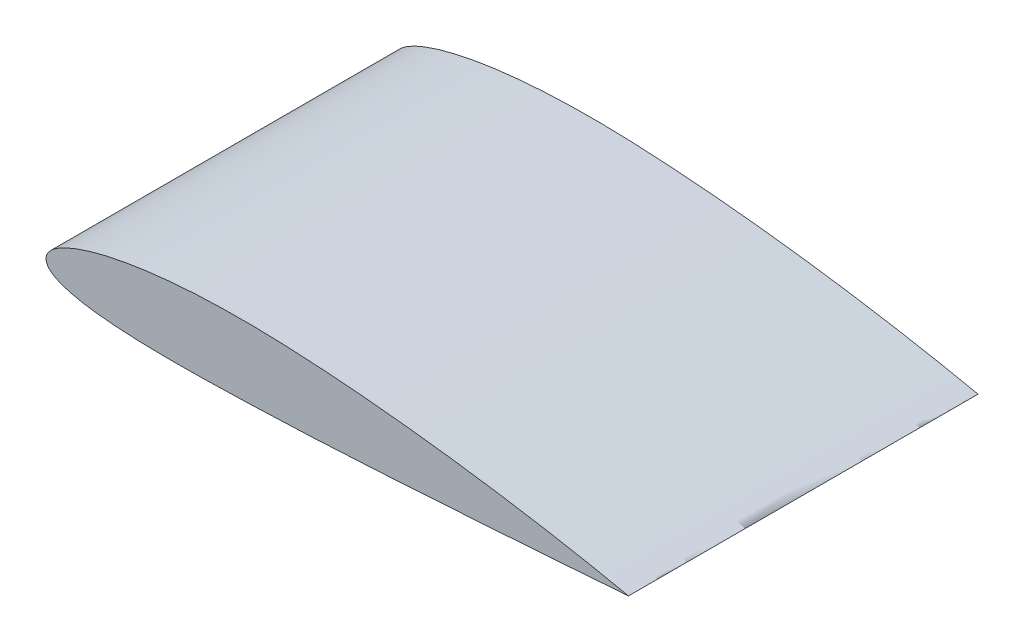
ISO-10303-21;
HEADER;
FILE_DESCRIPTION(('STEP AP214'),'2;1');
FILE_NAME('part.step','',(''),(''),'','','');
FILE_SCHEMA(('AUTOMOTIVE_DESIGN { 1 0 10303 214 1 1 1 1 }'));
ENDSEC;
DATA;
#1=APPLICATION_CONTEXT('core data for automotive mechanical design processes');
#2=APPLICATION_PROTOCOL_DEFINITION('international standard','automotive_design',2000,#1);
#3=PRODUCT_CONTEXT('',#1,'mechanical');
#4=PRODUCT('Part','Part','',(#3));
#5=PRODUCT_RELATED_PRODUCT_CATEGORY('part','',(#4));
#6=PRODUCT_DEFINITION_FORMATION('','',#4);
#7=PRODUCT_DEFINITION_CONTEXT('part definition',#1,'design');
#8=PRODUCT_DEFINITION('design','',#6,#7);
#9=PRODUCT_DEFINITION_SHAPE('','',#8);
#10=(LENGTH_UNIT() NAMED_UNIT(*) SI_UNIT(.MILLI.,.METRE.));
#11=(NAMED_UNIT(*) PLANE_ANGLE_UNIT() SI_UNIT($,.RADIAN.));
#12=(NAMED_UNIT(*) SI_UNIT($,.STERADIAN.) SOLID_ANGLE_UNIT());
#13=UNCERTAINTY_MEASURE_WITH_UNIT(LENGTH_MEASURE(1.E-05),#10,'distance_accuracy_value','');
#14=(GEOMETRIC_REPRESENTATION_CONTEXT(3) GLOBAL_UNCERTAINTY_ASSIGNED_CONTEXT((#13)) GLOBAL_UNIT_ASSIGNED_CONTEXT((#10,
#11,#12)) REPRESENTATION_CONTEXT('',''));
#15=CARTESIAN_POINT('',(0.,0.,0.));
#16=DIRECTION('',(0.,0.,1.));
#17=DIRECTION('',(1.,0.,0.));
#18=AXIS2_PLACEMENT_3D('',#15,#16,#17);
#19=CARTESIAN_POINT('',(150.,0.,90.));
#20=CARTESIAN_POINT('',(150.000113216751,0.00177285224793415,90.));
#21=CARTESIAN_POINT('',(149.921239361388,0.014188066800935,90.));
#22=CARTESIAN_POINT('',(149.840387791631,0.0358715199111897,90.));
#23=CARTESIAN_POINT('',(149.640781800527,0.075849773183066,90.));
#24=CARTESIAN_POINT('',(149.392078651045,0.129807126318734,90.));
#25=CARTESIAN_POINT('',(149.060600085422,0.199990784032261,90.));
#26=CARTESIAN_POINT('',(148.66042417078,0.284481373535448,90.));
#27=CARTESIAN_POINT('',(148.186888977134,0.384371921326002,90.));
#28=CARTESIAN_POINT('',(147.64208042319,0.4983469445077,90.));
#29=CARTESIAN_POINT('',(147.026096757238,0.62680991680176,90.));
#30=CARTESIAN_POINT('',(146.339540429164,0.768724971584994,90.));
#31=CARTESIAN_POINT('',(145.583125546069,0.924267178456114,90.));
#32=CARTESIAN_POINT('',(144.757444860907,1.09266217050406,90.));
#33=CARTESIAN_POINT('',(143.863349901552,1.27344456504119,90.));
#34=CARTESIAN_POINT('',(142.901656771357,1.4663863968593,90.));
#35=CARTESIAN_POINT('',(141.873202246748,1.67037475823978,90.));
#36=CARTESIAN_POINT('',(140.779031297345,1.88528433254788,90.));
#37=CARTESIAN_POINT('',(139.620134054833,2.11031172200272,90.));
#38=CARTESIAN_POINT('',(138.397638730328,2.3452126901847,90.));
#39=CARTESIAN_POINT('',(137.112596550764,2.58882458800582,90.));
#40=CARTESIAN_POINT('',(135.766314995586,2.84074487547482,90.));
#41=CARTESIAN_POINT('',(134.360029922316,3.10030017434261,90.));
#42=CARTESIAN_POINT('',(132.89510147769,3.36689567808418,90.));
#43=CARTESIAN_POINT('',(131.372880009807,3.63983625031875,90.));
#44=CARTESIAN_POINT('',(129.79489890091,3.91827985036904,90.));
#45=CARTESIAN_POINT('',(128.162544551591,4.20149249299851,90.));
#46=CARTESIAN_POINT('',(126.477528689931,4.48913421178522,90.));
#47=CARTESIAN_POINT('',(124.741283384557,4.78015890802335,90.));
#48=CARTESIAN_POINT('',(122.955664154135,5.07409806422994,90.));
#49=CARTESIAN_POINT('',(121.122204321478,5.36989331956641,90.));
#50=CARTESIAN_POINT('',(119.242834728598,5.66729606612383,90.));
#51=CARTESIAN_POINT('',(117.319233152594,5.96520336358199,90.));
#52=CARTESIAN_POINT('',(115.353399457422,6.26318283516786,90.));
#53=CARTESIAN_POINT('',(113.347150514401,6.56036872025142,90.));
#54=CARTESIAN_POINT('',(111.302509581045,6.85621489058943,90.));
#55=CARTESIAN_POINT('',(109.221376761532,7.15003078265159,90.));
#56=CARTESIAN_POINT('',(107.10581913627,7.44087658914807,90.));
#57=CARTESIAN_POINT('',(104.957931758204,7.72837998052587,90.));
#58=CARTESIAN_POINT('',(102.779829053978,8.01162883347343,90.));
#59=CARTESIAN_POINT('',(100.57363767051,8.29012723074574,90.));
#60=CARTESIAN_POINT('',(98.3414345197039,8.5630450436343,90.));
#61=CARTESIAN_POINT('',(96.0854790858782,8.82980262926822,90.));
#62=CARTESIAN_POINT('',(93.8080337795921,9.08986204992157,90.));
#63=CARTESIAN_POINT('',(91.511339391243,9.3424549993153,90.));
#64=CARTESIAN_POINT('',(89.1976707328889,9.58668778535293,90.));
#65=CARTESIAN_POINT('',(86.8692652264272,9.82230590537347,90.));
#66=CARTESIAN_POINT('',(84.5285234139239,10.0487006490159,90.));
#67=CARTESIAN_POINT('',(82.1776445380546,10.2647224017282,90.));
#68=CARTESIAN_POINT('',(79.819143688128,10.4704272334074,90.));
#69=CARTESIAN_POINT('',(77.4552218361354,10.6647703250394,90.));
#70=CARTESIAN_POINT('',(75.0883629006883,10.8475060451903,90.));
#71=CARTESIAN_POINT('',(72.7208472902247,11.017818628952,90.));
#72=CARTESIAN_POINT('',(70.3551070609961,11.1748869847106,90.));
#73=CARTESIAN_POINT('',(67.9934998772652,11.3190833130269,90.));
#74=CARTESIAN_POINT('',(65.6384111386436,11.4489169787279,90.));
#75=CARTESIAN_POINT('',(63.2922337082543,11.5645353912385,90.));
#76=CARTESIAN_POINT('',(60.9536614648223,11.665252270422,90.));
#77=CARTESIAN_POINT('',(58.6224769115101,11.7506800898829,90.));
#78=CARTESIAN_POINT('',(56.300885149099,11.81465053905,90.));
#79=CARTESIAN_POINT('',(53.9949998635085,11.8581881878371,90.));
#80=CARTESIAN_POINT('',(51.7097537153545,11.8805066732226,90.));
#81=CARTESIAN_POINT('',(49.4475551147668,11.8814387351758,90.));
#82=CARTESIAN_POINT('',(47.2108472765111,11.8614704165669,90.));
#83=CARTESIAN_POINT('',(45.0019437936583,11.8197374210162,90.));
#84=CARTESIAN_POINT('',(42.8232192868277,11.757393470768,90.));
#85=CARTESIAN_POINT('',(40.6769564437603,11.6734341017464,90.));
#86=CARTESIAN_POINT('',(38.565475313804,11.5688600599739,90.));
#87=CARTESIAN_POINT('',(36.4909522434168,11.4434357852618,90.));
#88=CARTESIAN_POINT('',(34.4556027015691,11.2979589994199,90.));
#89=CARTESIAN_POINT('',(32.4615706377804,11.1322151883279,90.));
#90=CARTESIAN_POINT('',(30.5109656102769,10.9471219442148,90.));
#91=CARTESIAN_POINT('',(28.6058662330469,10.7429022439941,90.));
#92=CARTESIAN_POINT('',(26.7482386483878,10.520352218942,90.));
#93=CARTESIAN_POINT('',(24.9400870672366,10.2796898510617,90.));
#94=CARTESIAN_POINT('',(23.1832434100823,10.0220726405033,90.));
#95=CARTESIAN_POINT('',(21.4795595088737,9.74787120930977,90.));
#96=CARTESIAN_POINT('',(19.8307385650777,9.45806431742482,90.));
#97=CARTESIAN_POINT('',(18.2385027267738,9.15310937460293,90.));
#98=CARTESIAN_POINT('',(16.7044275797058,8.83442687315617,90.));
#99=CARTESIAN_POINT('',(15.2301175902508,8.50231400325353,90.));
#100=CARTESIAN_POINT('',(13.8170756199545,8.15771601197067,90.));
#101=CARTESIAN_POINT('',(12.4665506425298,7.80208553751532,90.));
#102=CARTESIAN_POINT('',(11.1800605952099,7.4356946900673,90.));
#103=CARTESIAN_POINT('',(9.95873500301244,7.05972538908994,90.));
#104=CARTESIAN_POINT('',(8.80365956767617,6.67541441047379,90.));
#105=CARTESIAN_POINT('',(7.7161007799878,6.28317803049887,90.));
#106=CARTESIAN_POINT('',(6.69696394633503,5.88430015218207,90.));
#107=CARTESIAN_POINT('',(5.74712597272768,5.47964720124637,90.));
#108=CARTESIAN_POINT('',(4.86750545006497,5.0699459514628,90.));
#109=CARTESIAN_POINT('',(4.05886598209945,4.65596502600832,90.));
#110=CARTESIAN_POINT('',(3.32173745378701,4.23886123223077,90.));
#111=CARTESIAN_POINT('',(2.65675091884288,3.81912965603896,90.));
#112=CARTESIAN_POINT('',(2.06457278557886,3.39725235980044,90.));
#113=CARTESIAN_POINT('',(1.54506267000301,2.97441329115924,90.));
#114=CARTESIAN_POINT('',(1.09923906901222,2.55018976529029,90.));
#115=CARTESIAN_POINT('',(0.726894625470848,2.12551231454499,90.));
#116=CARTESIAN_POINT('',(0.428312168707512,1.70040026425423,90.));
#117=CARTESIAN_POINT('',(0.20429922980572,1.27463951355678,90.));
#118=CARTESIAN_POINT('',(0.0557754258817071,0.848305598459701,90.));
#119=CARTESIAN_POINT('',(-0.0169650124135932,0.422061313506713,90.));
#120=CARTESIAN_POINT('',(-0.012395685152107,-0.00125860981018384,90.));
#121=CARTESIAN_POINT('',(0.0670011801288433,-0.41703919780218,90.));
#122=CARTESIAN_POINT('',(0.222253099494257,-0.820467851313339,90.));
#123=CARTESIAN_POINT('',(0.451454628147086,-1.20896056871768,90.));
#124=CARTESIAN_POINT('',(0.753369521173824,-1.58250106706116,90.));
#125=CARTESIAN_POINT('',(1.12705883383546,-1.94131149621543,90.));
#126=CARTESIAN_POINT('',(1.57188853128574,-2.28567605802607,90.));
#127=CARTESIAN_POINT('',(2.08712356019238,-2.61601923163805,90.));
#128=CARTESIAN_POINT('',(2.67228188205189,-2.93254580250873,90.));
#129=CARTESIAN_POINT('',(3.3268228763119,-3.23516840373647,90.));
#130=CARTESIAN_POINT('',(4.05008206758963,-3.52384515953303,90.));
#131=CARTESIAN_POINT('',(4.8413562694083,-3.79847813878138,90.));
#132=CARTESIAN_POINT('',(5.69977977435213,-4.05908705634559,90.));
#133=CARTESIAN_POINT('',(6.62454152396939,-4.3055055801547,90.));
#134=CARTESIAN_POINT('',(7.61459143810924,-4.53778891485455,90.));
#135=CARTESIAN_POINT('',(8.66901592062998,-4.75567231681084,90.));
#136=CARTESIAN_POINT('',(9.78659902096796,-4.95950997509875,90.));
#137=CARTESIAN_POINT('',(10.966376396939,-5.14868737809658,90.));
#138=CARTESIAN_POINT('',(12.2070094919314,-5.32377557658016,90.));
#139=CARTESIAN_POINT('',(13.5073399421198,-5.48470017841474,90.));
#140=CARTESIAN_POINT('',(14.8660538914677,-5.63120443177975,90.));
#141=CARTESIAN_POINT('',(16.2818488945931,-5.76340357288891,90.));
#142=CARTESIAN_POINT('',(17.7532237401363,-5.88212349034162,90.));
#143=CARTESIAN_POINT('',(19.2788751706426,-5.98642681948964,90.));
#144=CARTESIAN_POINT('',(20.8572727758103,-6.07756324225612,90.));
#145=CARTESIAN_POINT('',(22.4869753976969,-6.15500988031534,90.));
#146=CARTESIAN_POINT('',(24.1664042954459,-6.21952465692351,90.));
#147=CARTESIAN_POINT('',(25.8939196246928,-6.271388473558,90.));
#148=CARTESIAN_POINT('',(27.6679832866412,-6.31042984078486,90.));
#149=CARTESIAN_POINT('',(29.4869269816174,-6.33799056202056,90.));
#150=CARTESIAN_POINT('',(31.3490704593932,-6.35332389653044,90.));
#151=CARTESIAN_POINT('',(33.2526518511894,-6.35808419683907,90.));
#152=CARTESIAN_POINT('',(35.1959781376705,-6.35179982271909,90.));
#153=CARTESIAN_POINT('',(37.17724702843,-6.33556735226127,90.));
#154=CARTESIAN_POINT('',(39.1947146286446,-6.31000242025638,90.));
#155=CARTESIAN_POINT('',(41.2464213224165,-6.27508799989196,90.));
#156=CARTESIAN_POINT('',(43.3305795557121,-6.23211588971754,90.));
#157=CARTESIAN_POINT('',(45.4452329449294,-6.1812930178478,90.));
#158=CARTESIAN_POINT('',(47.5885281453273,-6.12320424252715,90.));
#159=CARTESIAN_POINT('',(49.758475533371,-6.05890783843983,90.));
#160=CARTESIAN_POINT('',(51.9530751471376,-5.98898142758867,90.));
#161=CARTESIAN_POINT('',(54.17031133027,-5.91361619125998,90.));
#162=CARTESIAN_POINT('',(56.4082112732074,-5.83418590438628,90.));
#163=CARTESIAN_POINT('',(58.6671895514397,-5.75030983115732,90.));
#164=CARTESIAN_POINT('',(60.9488662196115,-5.66432058788184,90.));
#165=CARTESIAN_POINT('',(63.250776632651,-5.57092264816221,90.));
#166=CARTESIAN_POINT('',(65.5682847827032,-5.47093114425082,90.));
#167=CARTESIAN_POINT('',(67.8953750122427,-5.3643118844635,90.));
#168=CARTESIAN_POINT('',(70.2299184424443,-5.25206188941483,90.));
#169=CARTESIAN_POINT('',(72.5696143714918,-5.13473836472803,90.));
#170=CARTESIAN_POINT('',(74.9122110393863,-5.01279629763619,90.));
#171=CARTESIAN_POINT('',(77.2553990572395,-4.88656358960907,90.));
#172=CARTESIAN_POINT('',(79.5969005874024,-4.75689037004533,90.));
#173=CARTESIAN_POINT('',(81.9344805977109,-4.62370073691413,90.));
#174=CARTESIAN_POINT('',(84.2658877353853,-4.48824265701379,90.));
#175=CARTESIAN_POINT('',(86.5887662455826,-4.35010533939481,90.));
#176=CARTESIAN_POINT('',(88.9008701262797,-4.21055250979847,90.));
#177=CARTESIAN_POINT('',(91.1999674649236,-4.06944008337484,90.));
#178=CARTESIAN_POINT('',(93.483746102745,-3.92698566235611,90.));
#179=CARTESIAN_POINT('',(95.7500048922913,-3.78431662903994,90.));
#180=CARTESIAN_POINT('',(97.9964507786827,-3.64109164975605,90.));
#181=CARTESIAN_POINT('',(100.220933317543,-3.49761505893108,90.));
#182=CARTESIAN_POINT('',(102.421243984866,-3.35482425053552,90.));
#183=CARTESIAN_POINT('',(104.595180000877,-3.21225604128867,90.));
#184=CARTESIAN_POINT('',(106.740582819342,-3.07074585181546,90.));
#185=CARTESIAN_POINT('',(108.855333226112,-2.93024826329484,90.));
#186=CARTESIAN_POINT('',(110.937277964795,-2.79091658916875,90.));
#187=CARTESIAN_POINT('',(112.984422441069,-2.65308250402246,90.));
#188=CARTESIAN_POINT('',(114.99467338678,-2.51709488500874,90.));
#189=CARTESIAN_POINT('',(116.966029079818,-2.38307632816211,90.));
#190=CARTESIAN_POINT('',(118.896473704404,-2.25094529823088,90.));
#191=CARTESIAN_POINT('',(120.784116446478,-2.12103876166893,90.));
#192=CARTESIAN_POINT('',(122.627031686811,-1.99385713921875,90.));
#193=CARTESIAN_POINT('',(124.423315244363,-1.86881873379939,90.));
#194=CARTESIAN_POINT('',(126.171225554796,-1.74686493806983,90.));
#195=CARTESIAN_POINT('',(127.868964874687,-1.62756148081713,90.));
#196=CARTESIAN_POINT('',(129.514830791698,-1.51163516772187,90.));
#197=CARTESIAN_POINT('',(131.10711458699,-1.39845490509974,90.));
#198=CARTESIAN_POINT('',(132.644223096724,-1.28892306348485,90.));
#199=CARTESIAN_POINT('',(134.124570194074,-1.18273082380373,90.));
#200=CARTESIAN_POINT('',(135.546622318206,-1.08020845016104,90.));
#201=CARTESIAN_POINT('',(136.908961335048,-0.98130608304396,90.));
#202=CARTESIAN_POINT('',(138.210177450739,-0.886675592506177,90.));
#203=CARTESIAN_POINT('',(139.448910328729,-0.795690371820428,90.));
#204=CARTESIAN_POINT('',(140.623916070271,-0.709217892996005,90.));
#205=CARTESIAN_POINT('',(141.733972854607,-0.627107651773654,90.));
#206=CARTESIAN_POINT('',(142.77790646865,-0.549186231008332,90.));
#207=CARTESIAN_POINT('',(143.754710807956,-0.476195470533986,90.));
#208=CARTESIAN_POINT('',(144.663317679976,-0.40803121352214,90.));
#209=CARTESIAN_POINT('',(145.50275485455,-0.344525441990084,90.));
#210=CARTESIAN_POINT('',(146.272165578978,-0.286268283743654,90.));
#211=CARTESIAN_POINT('',(146.97069099182,-0.2329494283223,90.));
#212=CARTESIAN_POINT('',(147.597741081225,-0.185216864955988,90.));
#213=CARTESIAN_POINT('',(148.152412315563,-0.142547472074771,90.));
#214=CARTESIAN_POINT('',(148.634767327046,-0.105561748449276,90.));
#215=CARTESIAN_POINT('',(149.042495805844,-0.0740461371908622,90.));
#216=CARTESIAN_POINT('',(149.380323549398,-0.048183721364305,90.));
#217=CARTESIAN_POINT('',(149.633989171832,-0.0277355342951457,90.));
#218=CARTESIAN_POINT('',(149.837060335395,-0.014247733589623,90.));
#219=CARTESIAN_POINT('',(149.920038892511,-0.00355361758443977,90.));
#220=CARTESIAN_POINT('',(149.999886672342,-0.00177458892923922,90.));
#221=CARTESIAN_POINT('',(150.,0.,90.));
#222=B_SPLINE_CURVE_WITH_KNOTS('',3,(#19,#20,#21,#22,#23,#24,#25,#26,#27,#28,#29,#30,#31,#32,
#33,#34,#35,#36,#37,#38,#39,#40,#41,#42,#43,#44,#45,#46,#47,#48,#49,#50,#51,#52,#53,#54,#55,#56,
#57,#58,#59,#60,#61,#62,#63,#64,#65,#66,#67,#68,#69,#70,#71,#72,#73,#74,#75,#76,#77,#78,#79,#80,
#81,#82,#83,#84,#85,#86,#87,#88,#89,#90,#91,#92,#93,#94,#95,#96,#97,#98,#99,#100,#101,#102,#103,
#104,#105,#106,#107,#108,#109,#110,#111,#112,#113,#114,#115,#116,#117,#118,#119,#120,#121,#122,
#123,#124,#125,#126,#127,#128,#129,#130,#131,#132,#133,#134,#135,#136,#137,#138,#139,#140,#141,
#142,#143,#144,#145,#146,#147,#148,#149,#150,#151,#152,#153,#154,#155,#156,#157,#158,#159,#160,
#161,#162,#163,#164,#165,#166,#167,#168,#169,#170,#171,#172,#173,#174,#175,#176,#177,#178,#179,
#180,#181,#182,#183,#184,#185,#186,#187,#188,#189,#190,#191,#192,#193,#194,#195,#196,#197,#198,
#199,#200,#201,#202,#203,#204,#205,#206,#207,#208,#209,#210,#211,#212,#213,#214,#215,#216,#217,
#218,#219,#220,#221),.UNSPECIFIED.,.T.,.F.,(4,1,1,1,1,1,1,1,1,1,1,1,1,1,1,1,1,1,1,1,1,1,1,1,1,1,
1,1,1,1,1,1,1,1,1,1,1,1,1,1,1,1,1,1,1,1,1,1,1,1,1,1,1,1,1,1,1,1,1,1,1,1,1,1,1,1,1,1,1,1,1,1,1,1,
1,1,1,1,1,1,1,1,1,1,1,1,1,1,1,1,1,1,1,1,1,1,1,1,1,1,1,1,1,1,1,1,1,1,1,1,1,1,1,1,1,1,1,1,1,1,1,1,
1,1,1,1,1,1,1,1,1,1,1,1,1,1,1,1,1,1,1,1,1,1,1,1,1,1,1,1,1,1,1,1,1,1,1,1,1,1,1,1,1,1,1,1,1,1,1,1,
1,1,1,1,1,1,1,1,1,1,1,1,1,1,1,1,1,1,1,1,1,1,1,1,1,1,1,1,1,1,4),(0.,0.000122196085766626,
0.000489365674763902,0.00110082515847169,0.00195561670375771,0.00305326124421761,
0.0043923943404863,0.00597215988794711,0.00779071765370783,0.0098460518607421,
0.0121358481378064,0.0146585724727866,0.0174109567661997,0.0203907946372057,0.0235944422936173,
0.0270195083185235,0.0306618768267846,0.034517820825056,0.0385841918221291,0.0428566077302622,
0.0473303969030419,0.0520013738714391,0.0568653585176347,0.0619166434750515,0.067150975970567,
0.0725621829377947,0.0781461949991966,0.0838962869396703,0.0898078376931779,0.0958736588795064,
0.102089222907842,0.108447359725601,0.114942027985738,0.121566635914124,0.128315157099272,
0.13518004845183,0.142155718034686,0.149234225289835,0.156408543487029,0.163672206269628,
0.171017724489298,0.178438167007162,0.185925639261017,0.193472689327582,0.201072369483472,
0.208716387711787,0.216398360352787,0.224109390785538,0.231842731829097,0.239590054981512,
0.247344596751765,0.255097582505955,0.262842253241343,0.270570497442088,0.278275047283707,
0.285947798630161,0.293581596865128,0.301205000486143,0.308799369711134,0.316332418938321,
0.323797386891231,0.331186573599908,0.338492792236208,0.345708892881396,0.352828692223138,
0.359844134063179,0.366749559674175,0.37353790172603,0.380203039347441,0.386738456302258,
0.393138526665271,0.399396709968799,0.40550741662351,0.411465630518624,0.417265202307671,
0.422901112123709,0.428369272014003,0.433664187104901,0.43878166419717,0.443717373947704,
0.448467820301078,0.453028858500005,0.457397402477659,0.461570587819974,0.465546141423774,
0.46932135829799,0.472894853715186,0.476265704920863,0.479433597356692,0.482398569931637,
0.485162646508904,0.487727712557809,0.490098465312051,0.492281079476947,0.494284100191654,
0.496120044314417,0.497804998803595,0.499361514932928,0.500817848691796,0.502209372417482,
0.503576005127044,0.504942779144565,0.506334017938843,0.507789351416866,0.509343567978195,
0.511024575484683,0.512853072219707,0.514845747940614,0.517013675654912,0.519365206886376,
0.521905927536904,0.524639219507371,0.527567761098312,0.530692137764685,0.534012768816974,
0.537528408110369,0.541238498540789,0.545140396370302,0.549232452486758,0.553511633691477,
0.557975144929239,0.562619171323539,0.567440800286636,0.572435326988302,0.577599138840892,
0.582928397248096,0.588417794072475,0.594062897606315,0.599858713008126,0.60580072143049,
0.611883327381791,0.61810092162125,0.624448324454409,0.630920319519652,0.637510181471832,
0.644213127308748,0.651021867253095,0.65793106977823,0.664934393666822,0.672025449673305,
0.679197367072492,0.686443768101322,0.693758214048162,0.701133817001137,0.708588155837644,
0.716125564590403,0.723702045608803,0.731311757181539,0.738945825480526,0.746597832734235,
0.754260397886221,0.761925155286445,0.769585173832593,0.777233081566335,0.784861418630345,
0.792462344680593,0.800028389962042,0.80755219864688,0.815026873284594,0.822443955994548,
0.829796606902814,0.837077924162101,0.844280452584944,0.851396373902826,0.858419728878918,
0.86534266683878,0.8721583146347,0.878860254924878,0.885442069757299,0.891895907850742,
0.898216394754841,0.904397111966381,0.910431151817769,0.916312685257085,0.922036236349587,
0.92759545376929,0.932984894954008,0.93819922071917,0.943232953541848,0.948080719862535,
0.952738088488609,0.957199651070045,0.961461429146028,0.965518573937616,0.969367070746006,
0.973003012145282,0.976422491145842,0.979621979933377,0.982598548090451,0.98534828865777,
0.987868686182522,0.990157298903152,0.992211122254721,0.994028728546509,0.995608089554708,
0.996946763495682,0.998044750476183,0.998899533320879,0.999510699253848,0.999877684211276,1.),.UNSPECIFIED.);
#223=DIRECTION('',(0.,0.,-1.));
#224=VECTOR('',#223,1.);
#225=SURFACE_OF_LINEAR_EXTRUSION('',#222,#224);
#226=CARTESIAN_POINT('',(150.,0.,90.));
#227=VERTEX_POINT('',#226);
#228=EDGE_CURVE('E10',#227,#227,#222,.T.);
#229=ORIENTED_EDGE('',*,*,#228,.F.);
#230=EDGE_LOOP('',(#229));
#231=FACE_BOUND('',#230,.T.);
#232=CARTESIAN_POINT('',(150.,0.,0.));
#233=CARTESIAN_POINT('',(150.000113216751,0.00177285224793415,0.));
#234=CARTESIAN_POINT('',(149.921239361388,0.014188066800935,0.));
#235=CARTESIAN_POINT('',(149.840387791631,0.0358715199111897,0.));
#236=CARTESIAN_POINT('',(149.640781800527,0.075849773183066,0.));
#237=CARTESIAN_POINT('',(149.392078651045,0.129807126318734,0.));
#238=CARTESIAN_POINT('',(149.060600085422,0.199990784032261,0.));
#239=CARTESIAN_POINT('',(148.66042417078,0.284481373535448,0.));
#240=CARTESIAN_POINT('',(148.186888977134,0.384371921326002,0.));
#241=CARTESIAN_POINT('',(147.64208042319,0.4983469445077,0.));
#242=CARTESIAN_POINT('',(147.026096757238,0.62680991680176,0.));
#243=CARTESIAN_POINT('',(146.339540429164,0.768724971584994,0.));
#244=CARTESIAN_POINT('',(145.583125546069,0.924267178456114,0.));
#245=CARTESIAN_POINT('',(144.757444860907,1.09266217050406,0.));
#246=CARTESIAN_POINT('',(143.863349901552,1.27344456504119,0.));
#247=CARTESIAN_POINT('',(142.901656771357,1.4663863968593,0.));
#248=CARTESIAN_POINT('',(141.873202246748,1.67037475823978,0.));
#249=CARTESIAN_POINT('',(140.779031297345,1.88528433254788,0.));
#250=CARTESIAN_POINT('',(139.620134054833,2.11031172200272,0.));
#251=CARTESIAN_POINT('',(138.397638730328,2.3452126901847,0.));
#252=CARTESIAN_POINT('',(137.112596550764,2.58882458800582,0.));
#253=CARTESIAN_POINT('',(135.766314995586,2.84074487547482,0.));
#254=CARTESIAN_POINT('',(134.360029922316,3.10030017434261,0.));
#255=CARTESIAN_POINT('',(132.89510147769,3.36689567808418,0.));
#256=CARTESIAN_POINT('',(131.372880009807,3.63983625031875,0.));
#257=CARTESIAN_POINT('',(129.79489890091,3.91827985036904,0.));
#258=CARTESIAN_POINT('',(128.162544551591,4.20149249299851,0.));
#259=CARTESIAN_POINT('',(126.477528689931,4.48913421178522,0.));
#260=CARTESIAN_POINT('',(124.741283384557,4.78015890802335,0.));
#261=CARTESIAN_POINT('',(122.955664154135,5.07409806422994,0.));
#262=CARTESIAN_POINT('',(121.122204321478,5.36989331956641,0.));
#263=CARTESIAN_POINT('',(119.242834728598,5.66729606612383,0.));
#264=CARTESIAN_POINT('',(117.319233152594,5.96520336358199,0.));
#265=CARTESIAN_POINT('',(115.353399457422,6.26318283516786,0.));
#266=CARTESIAN_POINT('',(113.347150514401,6.56036872025142,0.));
#267=CARTESIAN_POINT('',(111.302509581045,6.85621489058943,0.));
#268=CARTESIAN_POINT('',(109.221376761532,7.15003078265159,0.));
#269=CARTESIAN_POINT('',(107.10581913627,7.44087658914807,0.));
#270=CARTESIAN_POINT('',(104.957931758204,7.72837998052587,0.));
#271=CARTESIAN_POINT('',(102.779829053978,8.01162883347343,0.));
#272=CARTESIAN_POINT('',(100.57363767051,8.29012723074574,0.));
#273=CARTESIAN_POINT('',(98.3414345197039,8.5630450436343,0.));
#274=CARTESIAN_POINT('',(96.0854790858782,8.82980262926822,0.));
#275=CARTESIAN_POINT('',(93.8080337795921,9.08986204992157,0.));
#276=CARTESIAN_POINT('',(91.511339391243,9.3424549993153,0.));
#277=CARTESIAN_POINT('',(89.1976707328889,9.58668778535293,0.));
#278=CARTESIAN_POINT('',(86.8692652264272,9.82230590537347,0.));
#279=CARTESIAN_POINT('',(84.5285234139239,10.0487006490159,0.));
#280=CARTESIAN_POINT('',(82.1776445380546,10.2647224017282,0.));
#281=CARTESIAN_POINT('',(79.819143688128,10.4704272334074,0.));
#282=CARTESIAN_POINT('',(77.4552218361354,10.6647703250394,0.));
#283=CARTESIAN_POINT('',(75.0883629006883,10.8475060451903,0.));
#284=CARTESIAN_POINT('',(72.7208472902247,11.017818628952,0.));
#285=CARTESIAN_POINT('',(70.3551070609961,11.1748869847106,0.));
#286=CARTESIAN_POINT('',(67.9934998772652,11.3190833130269,0.));
#287=CARTESIAN_POINT('',(65.6384111386436,11.4489169787279,0.));
#288=CARTESIAN_POINT('',(63.2922337082543,11.5645353912385,0.));
#289=CARTESIAN_POINT('',(60.9536614648223,11.665252270422,0.));
#290=CARTESIAN_POINT('',(58.6224769115101,11.7506800898829,0.));
#291=CARTESIAN_POINT('',(56.300885149099,11.81465053905,0.));
#292=CARTESIAN_POINT('',(53.9949998635085,11.8581881878371,0.));
#293=CARTESIAN_POINT('',(51.7097537153545,11.8805066732226,0.));
#294=CARTESIAN_POINT('',(49.4475551147668,11.8814387351758,0.));
#295=CARTESIAN_POINT('',(47.2108472765111,11.8614704165669,0.));
#296=CARTESIAN_POINT('',(45.0019437936583,11.8197374210162,0.));
#297=CARTESIAN_POINT('',(42.8232192868277,11.757393470768,0.));
#298=CARTESIAN_POINT('',(40.6769564437603,11.6734341017464,0.));
#299=CARTESIAN_POINT('',(38.565475313804,11.5688600599739,0.));
#300=CARTESIAN_POINT('',(36.4909522434168,11.4434357852618,0.));
#301=CARTESIAN_POINT('',(34.4556027015691,11.2979589994199,0.));
#302=CARTESIAN_POINT('',(32.4615706377804,11.1322151883279,0.));
#303=CARTESIAN_POINT('',(30.5109656102769,10.9471219442148,0.));
#304=CARTESIAN_POINT('',(28.6058662330469,10.7429022439941,0.));
#305=CARTESIAN_POINT('',(26.7482386483878,10.520352218942,0.));
#306=CARTESIAN_POINT('',(24.9400870672366,10.2796898510617,0.));
#307=CARTESIAN_POINT('',(23.1832434100823,10.0220726405033,0.));
#308=CARTESIAN_POINT('',(21.4795595088737,9.74787120930977,0.));
#309=CARTESIAN_POINT('',(19.8307385650777,9.45806431742482,0.));
#310=CARTESIAN_POINT('',(18.2385027267738,9.15310937460293,0.));
#311=CARTESIAN_POINT('',(16.7044275797058,8.83442687315617,0.));
#312=CARTESIAN_POINT('',(15.2301175902508,8.50231400325353,0.));
#313=CARTESIAN_POINT('',(13.8170756199545,8.15771601197067,0.));
#314=CARTESIAN_POINT('',(12.4665506425298,7.80208553751532,0.));
#315=CARTESIAN_POINT('',(11.1800605952099,7.4356946900673,0.));
#316=CARTESIAN_POINT('',(9.95873500301244,7.05972538908994,0.));
#317=CARTESIAN_POINT('',(8.80365956767617,6.67541441047379,0.));
#318=CARTESIAN_POINT('',(7.7161007799878,6.28317803049887,0.));
#319=CARTESIAN_POINT('',(6.69696394633503,5.88430015218207,0.));
#320=CARTESIAN_POINT('',(5.74712597272768,5.47964720124637,0.));
#321=CARTESIAN_POINT('',(4.86750545006497,5.0699459514628,0.));
#322=CARTESIAN_POINT('',(4.05886598209945,4.65596502600832,0.));
#323=CARTESIAN_POINT('',(3.32173745378701,4.23886123223077,0.));
#324=CARTESIAN_POINT('',(2.65675091884288,3.81912965603896,0.));
#325=CARTESIAN_POINT('',(2.06457278557886,3.39725235980044,0.));
#326=CARTESIAN_POINT('',(1.54506267000301,2.97441329115924,0.));
#327=CARTESIAN_POINT('',(1.09923906901222,2.55018976529029,0.));
#328=CARTESIAN_POINT('',(0.726894625470848,2.12551231454499,0.));
#329=CARTESIAN_POINT('',(0.428312168707512,1.70040026425423,0.));
#330=CARTESIAN_POINT('',(0.20429922980572,1.27463951355678,0.));
#331=CARTESIAN_POINT('',(0.0557754258817071,0.848305598459701,0.));
#332=CARTESIAN_POINT('',(-0.0169650124135932,0.422061313506713,0.));
#333=CARTESIAN_POINT('',(-0.012395685152107,-0.00125860981018384,0.));
#334=CARTESIAN_POINT('',(0.0670011801288433,-0.41703919780218,0.));
#335=CARTESIAN_POINT('',(0.222253099494257,-0.820467851313339,0.));
#336=CARTESIAN_POINT('',(0.451454628147086,-1.20896056871768,0.));
#337=CARTESIAN_POINT('',(0.753369521173824,-1.58250106706116,0.));
#338=CARTESIAN_POINT('',(1.12705883383546,-1.94131149621543,0.));
#339=CARTESIAN_POINT('',(1.57188853128574,-2.28567605802607,0.));
#340=CARTESIAN_POINT('',(2.08712356019238,-2.61601923163805,0.));
#341=CARTESIAN_POINT('',(2.67228188205189,-2.93254580250873,0.));
#342=CARTESIAN_POINT('',(3.3268228763119,-3.23516840373647,0.));
#343=CARTESIAN_POINT('',(4.05008206758963,-3.52384515953303,0.));
#344=CARTESIAN_POINT('',(4.8413562694083,-3.79847813878138,0.));
#345=CARTESIAN_POINT('',(5.69977977435213,-4.05908705634559,0.));
#346=CARTESIAN_POINT('',(6.62454152396939,-4.3055055801547,0.));
#347=CARTESIAN_POINT('',(7.61459143810924,-4.53778891485455,0.));
#348=CARTESIAN_POINT('',(8.66901592062998,-4.75567231681084,0.));
#349=CARTESIAN_POINT('',(9.78659902096796,-4.95950997509875,0.));
#350=CARTESIAN_POINT('',(10.966376396939,-5.14868737809658,0.));
#351=CARTESIAN_POINT('',(12.2070094919314,-5.32377557658016,0.));
#352=CARTESIAN_POINT('',(13.5073399421198,-5.48470017841474,0.));
#353=CARTESIAN_POINT('',(14.8660538914677,-5.63120443177975,0.));
#354=CARTESIAN_POINT('',(16.2818488945931,-5.76340357288891,0.));
#355=CARTESIAN_POINT('',(17.7532237401363,-5.88212349034162,0.));
#356=CARTESIAN_POINT('',(19.2788751706426,-5.98642681948964,0.));
#357=CARTESIAN_POINT('',(20.8572727758103,-6.07756324225612,0.));
#358=CARTESIAN_POINT('',(22.4869753976969,-6.15500988031534,0.));
#359=CARTESIAN_POINT('',(24.1664042954459,-6.21952465692351,0.));
#360=CARTESIAN_POINT('',(25.8939196246928,-6.271388473558,0.));
#361=CARTESIAN_POINT('',(27.6679832866412,-6.31042984078486,0.));
#362=CARTESIAN_POINT('',(29.4869269816174,-6.33799056202056,0.));
#363=CARTESIAN_POINT('',(31.3490704593932,-6.35332389653044,0.));
#364=CARTESIAN_POINT('',(33.2526518511894,-6.35808419683907,0.));
#365=CARTESIAN_POINT('',(35.1959781376705,-6.35179982271909,0.));
#366=CARTESIAN_POINT('',(37.17724702843,-6.33556735226127,0.));
#367=CARTESIAN_POINT('',(39.1947146286446,-6.31000242025638,0.));
#368=CARTESIAN_POINT('',(41.2464213224165,-6.27508799989196,0.));
#369=CARTESIAN_POINT('',(43.3305795557121,-6.23211588971754,0.));
#370=CARTESIAN_POINT('',(45.4452329449294,-6.1812930178478,0.));
#371=CARTESIAN_POINT('',(47.5885281453273,-6.12320424252715,0.));
#372=CARTESIAN_POINT('',(49.758475533371,-6.05890783843983,0.));
#373=CARTESIAN_POINT('',(51.9530751471376,-5.98898142758867,0.));
#374=CARTESIAN_POINT('',(54.17031133027,-5.91361619125998,0.));
#375=CARTESIAN_POINT('',(56.4082112732074,-5.83418590438628,0.));
#376=CARTESIAN_POINT('',(58.6671895514397,-5.75030983115732,0.));
#377=CARTESIAN_POINT('',(60.9488662196115,-5.66432058788184,0.));
#378=CARTESIAN_POINT('',(63.250776632651,-5.57092264816221,0.));
#379=CARTESIAN_POINT('',(65.5682847827032,-5.47093114425082,0.));
#380=CARTESIAN_POINT('',(67.8953750122427,-5.3643118844635,0.));
#381=CARTESIAN_POINT('',(70.2299184424443,-5.25206188941483,0.));
#382=CARTESIAN_POINT('',(72.5696143714918,-5.13473836472803,0.));
#383=CARTESIAN_POINT('',(74.9122110393863,-5.01279629763619,0.));
#384=CARTESIAN_POINT('',(77.2553990572395,-4.88656358960907,0.));
#385=CARTESIAN_POINT('',(79.5969005874024,-4.75689037004533,0.));
#386=CARTESIAN_POINT('',(81.9344805977109,-4.62370073691413,0.));
#387=CARTESIAN_POINT('',(84.2658877353853,-4.48824265701379,0.));
#388=CARTESIAN_POINT('',(86.5887662455826,-4.35010533939481,0.));
#389=CARTESIAN_POINT('',(88.9008701262797,-4.21055250979847,0.));
#390=CARTESIAN_POINT('',(91.1999674649236,-4.06944008337484,0.));
#391=CARTESIAN_POINT('',(93.483746102745,-3.92698566235611,0.));
#392=CARTESIAN_POINT('',(95.7500048922913,-3.78431662903994,0.));
#393=CARTESIAN_POINT('',(97.9964507786827,-3.64109164975605,0.));
#394=CARTESIAN_POINT('',(100.220933317543,-3.49761505893108,0.));
#395=CARTESIAN_POINT('',(102.421243984866,-3.35482425053552,0.));
#396=CARTESIAN_POINT('',(104.595180000877,-3.21225604128867,0.));
#397=CARTESIAN_POINT('',(106.740582819342,-3.07074585181546,0.));
#398=CARTESIAN_POINT('',(108.855333226112,-2.93024826329484,0.));
#399=CARTESIAN_POINT('',(110.937277964795,-2.79091658916875,0.));
#400=CARTESIAN_POINT('',(112.984422441069,-2.65308250402246,0.));
#401=CARTESIAN_POINT('',(114.99467338678,-2.51709488500874,0.));
#402=CARTESIAN_POINT('',(116.966029079818,-2.38307632816211,0.));
#403=CARTESIAN_POINT('',(118.896473704404,-2.25094529823088,0.));
#404=CARTESIAN_POINT('',(120.784116446478,-2.12103876166893,0.));
#405=CARTESIAN_POINT('',(122.627031686811,-1.99385713921875,0.));
#406=CARTESIAN_POINT('',(124.423315244363,-1.86881873379939,0.));
#407=CARTESIAN_POINT('',(126.171225554796,-1.74686493806983,0.));
#408=CARTESIAN_POINT('',(127.868964874687,-1.62756148081713,0.));
#409=CARTESIAN_POINT('',(129.514830791698,-1.51163516772187,0.));
#410=CARTESIAN_POINT('',(131.10711458699,-1.39845490509974,0.));
#411=CARTESIAN_POINT('',(132.644223096724,-1.28892306348485,0.));
#412=CARTESIAN_POINT('',(134.124570194074,-1.18273082380373,0.));
#413=CARTESIAN_POINT('',(135.546622318206,-1.08020845016104,0.));
#414=CARTESIAN_POINT('',(136.908961335048,-0.98130608304396,0.));
#415=CARTESIAN_POINT('',(138.210177450739,-0.886675592506177,0.));
#416=CARTESIAN_POINT('',(139.448910328729,-0.795690371820428,0.));
#417=CARTESIAN_POINT('',(140.623916070271,-0.709217892996005,0.));
#418=CARTESIAN_POINT('',(141.733972854607,-0.627107651773654,0.));
#419=CARTESIAN_POINT('',(142.77790646865,-0.549186231008332,0.));
#420=CARTESIAN_POINT('',(143.754710807956,-0.476195470533986,0.));
#421=CARTESIAN_POINT('',(144.663317679976,-0.40803121352214,0.));
#422=CARTESIAN_POINT('',(145.50275485455,-0.344525441990084,0.));
#423=CARTESIAN_POINT('',(146.272165578978,-0.286268283743654,0.));
#424=CARTESIAN_POINT('',(146.97069099182,-0.2329494283223,0.));
#425=CARTESIAN_POINT('',(147.597741081225,-0.185216864955988,0.));
#426=CARTESIAN_POINT('',(148.152412315563,-0.142547472074771,0.));
#427=CARTESIAN_POINT('',(148.634767327046,-0.105561748449276,0.));
#428=CARTESIAN_POINT('',(149.042495805844,-0.0740461371908622,0.));
#429=CARTESIAN_POINT('',(149.380323549398,-0.048183721364305,0.));
#430=CARTESIAN_POINT('',(149.633989171832,-0.0277355342951457,0.));
#431=CARTESIAN_POINT('',(149.837060335395,-0.014247733589623,0.));
#432=CARTESIAN_POINT('',(149.920038892511,-0.00355361758443977,0.));
#433=CARTESIAN_POINT('',(149.999886672342,-0.00177458892923922,0.));
#434=CARTESIAN_POINT('',(150.,0.,0.));
#435=B_SPLINE_CURVE_WITH_KNOTS('',3,(#232,#233,#234,#235,#236,#237,#238,#239,#240,#241,#242,
#243,#244,#245,#246,#247,#248,#249,#250,#251,#252,#253,#254,#255,#256,#257,#258,#259,#260,#261,
#262,#263,#264,#265,#266,#267,#268,#269,#270,#271,#272,#273,#274,#275,#276,#277,#278,#279,#280,
#281,#282,#283,#284,#285,#286,#287,#288,#289,#290,#291,#292,#293,#294,#295,#296,#297,#298,#299,
#300,#301,#302,#303,#304,#305,#306,#307,#308,#309,#310,#311,#312,#313,#314,#315,#316,#317,#318,
#319,#320,#321,#322,#323,#324,#325,#326,#327,#328,#329,#330,#331,#332,#333,#334,#335,#336,#337,
#338,#339,#340,#341,#342,#343,#344,#345,#346,#347,#348,#349,#350,#351,#352,#353,#354,#355,#356,
#357,#358,#359,#360,#361,#362,#363,#364,#365,#366,#367,#368,#369,#370,#371,#372,#373,#374,#375,
#376,#377,#378,#379,#380,#381,#382,#383,#384,#385,#386,#387,#388,#389,#390,#391,#392,#393,#394,
#395,#396,#397,#398,#399,#400,#401,#402,#403,#404,#405,#406,#407,#408,#409,#410,#411,#412,#413,
#414,#415,#416,#417,#418,#419,#420,#421,#422,#423,#424,#425,#426,#427,#428,#429,#430,#431,#432,
#433,#434),.UNSPECIFIED.,.T.,.F.,(4,1,1,1,1,1,1,1,1,1,1,1,1,1,1,1,1,1,1,1,1,1,1,1,1,1,1,1,1,1,1,
1,1,1,1,1,1,1,1,1,1,1,1,1,1,1,1,1,1,1,1,1,1,1,1,1,1,1,1,1,1,1,1,1,1,1,1,1,1,1,1,1,1,1,1,1,1,1,1,
1,1,1,1,1,1,1,1,1,1,1,1,1,1,1,1,1,1,1,1,1,1,1,1,1,1,1,1,1,1,1,1,1,1,1,1,1,1,1,1,1,1,1,1,1,1,1,1,
1,1,1,1,1,1,1,1,1,1,1,1,1,1,1,1,1,1,1,1,1,1,1,1,1,1,1,1,1,1,1,1,1,1,1,1,1,1,1,1,1,1,1,1,1,1,1,1,
1,1,1,1,1,1,1,1,1,1,1,1,1,1,1,1,1,1,1,1,1,1,1,1,1,4),(0.,0.000122196085766626,
0.000489365674763902,0.00110082515847169,0.00195561670375771,0.00305326124421761,
0.0043923943404863,0.00597215988794711,0.00779071765370783,0.0098460518607421,
0.0121358481378064,0.0146585724727866,0.0174109567661997,0.0203907946372057,0.0235944422936173,
0.0270195083185235,0.0306618768267846,0.034517820825056,0.0385841918221291,0.0428566077302622,
0.0473303969030419,0.0520013738714391,0.0568653585176347,0.0619166434750515,0.067150975970567,
0.0725621829377947,0.0781461949991966,0.0838962869396703,0.0898078376931779,0.0958736588795064,
0.102089222907842,0.108447359725601,0.114942027985738,0.121566635914124,0.128315157099272,
0.13518004845183,0.142155718034686,0.149234225289835,0.156408543487029,0.163672206269628,
0.171017724489298,0.178438167007162,0.185925639261017,0.193472689327582,0.201072369483472,
0.208716387711787,0.216398360352787,0.224109390785538,0.231842731829097,0.239590054981512,
0.247344596751765,0.255097582505955,0.262842253241343,0.270570497442088,0.278275047283707,
0.285947798630161,0.293581596865128,0.301205000486143,0.308799369711134,0.316332418938321,
0.323797386891231,0.331186573599908,0.338492792236208,0.345708892881396,0.352828692223138,
0.359844134063179,0.366749559674175,0.37353790172603,0.380203039347441,0.386738456302258,
0.393138526665271,0.399396709968799,0.40550741662351,0.411465630518624,0.417265202307671,
0.422901112123709,0.428369272014003,0.433664187104901,0.43878166419717,0.443717373947704,
0.448467820301078,0.453028858500005,0.457397402477659,0.461570587819974,0.465546141423774,
0.46932135829799,0.472894853715186,0.476265704920863,0.479433597356692,0.482398569931637,
0.485162646508904,0.487727712557809,0.490098465312051,0.492281079476947,0.494284100191654,
0.496120044314417,0.497804998803595,0.499361514932928,0.500817848691796,0.502209372417482,
0.503576005127044,0.504942779144565,0.506334017938843,0.507789351416866,0.509343567978195,
0.511024575484683,0.512853072219707,0.514845747940614,0.517013675654912,0.519365206886376,
0.521905927536904,0.524639219507371,0.527567761098312,0.530692137764685,0.534012768816974,
0.537528408110369,0.541238498540789,0.545140396370302,0.549232452486758,0.553511633691477,
0.557975144929239,0.562619171323539,0.567440800286636,0.572435326988302,0.577599138840892,
0.582928397248096,0.588417794072475,0.594062897606315,0.599858713008126,0.60580072143049,
0.611883327381791,0.61810092162125,0.624448324454409,0.630920319519652,0.637510181471832,
0.644213127308748,0.651021867253095,0.65793106977823,0.664934393666822,0.672025449673305,
0.679197367072492,0.686443768101322,0.693758214048162,0.701133817001137,0.708588155837644,
0.716125564590403,0.723702045608803,0.731311757181539,0.738945825480526,0.746597832734235,
0.754260397886221,0.761925155286445,0.769585173832593,0.777233081566335,0.784861418630345,
0.792462344680593,0.800028389962042,0.80755219864688,0.815026873284594,0.822443955994548,
0.829796606902814,0.837077924162101,0.844280452584944,0.851396373902826,0.858419728878918,
0.86534266683878,0.8721583146347,0.878860254924878,0.885442069757299,0.891895907850742,
0.898216394754841,0.904397111966381,0.910431151817769,0.916312685257085,0.922036236349587,
0.92759545376929,0.932984894954008,0.93819922071917,0.943232953541848,0.948080719862535,
0.952738088488609,0.957199651070045,0.961461429146028,0.965518573937616,0.969367070746006,
0.973003012145282,0.976422491145842,0.979621979933377,0.982598548090451,0.98534828865777,
0.987868686182522,0.990157298903152,0.992211122254721,0.994028728546509,0.995608089554708,
0.996946763495682,0.998044750476183,0.998899533320879,0.999510699253848,0.999877684211276,1.),.UNSPECIFIED.);
#436=CARTESIAN_POINT('',(150.,0.,0.));
#437=VERTEX_POINT('',#436);
#438=EDGE_CURVE('E47',#437,#437,#435,.T.);
#439=ORIENTED_EDGE('',*,*,#438,.T.);
#440=EDGE_LOOP('',(#439));
#441=FACE_BOUND('',#440,.T.);
#442=ADVANCED_FACE('F43',(#231,#441),#225,.F.);
#443=CARTESIAN_POINT('',(0.139102075885136,1.07848873999057,90.));
#444=DIRECTION('',(0.,0.,-1.));
#445=DIRECTION('',(-1.,0.,0.));
#446=AXIS2_PLACEMENT_3D('',#443,#444,#445);
#447=PLANE('',#446);
#448=ORIENTED_EDGE('',*,*,#228,.T.);
#449=EDGE_LOOP('',(#448));
#450=FACE_BOUND('',#449,.T.);
#451=ADVANCED_FACE('F68',(#450),#447,.F.);
#452=CARTESIAN_POINT('',(0.139102075885136,1.07848873999057,0.));
#453=DIRECTION('',(0.,0.,-1.));
#454=DIRECTION('',(-1.,0.,0.));
#455=AXIS2_PLACEMENT_3D('',#452,#453,#454);
#456=PLANE('',#455);
#457=ORIENTED_EDGE('',*,*,#438,.F.);
#458=EDGE_LOOP('',(#457));
#459=FACE_BOUND('',#458,.T.);
#460=ADVANCED_FACE('F66',(#459),#456,.T.);
#461=CLOSED_SHELL('',(#442,#451,#460));
#462=MANIFOLD_SOLID_BREP('B2',#461);
#463=ADVANCED_BREP_SHAPE_REPRESENTATION('',(#18,#462),#14);
#464=SHAPE_DEFINITION_REPRESENTATION(#9,#463);
ENDSEC;
END-ISO-10303-21;
